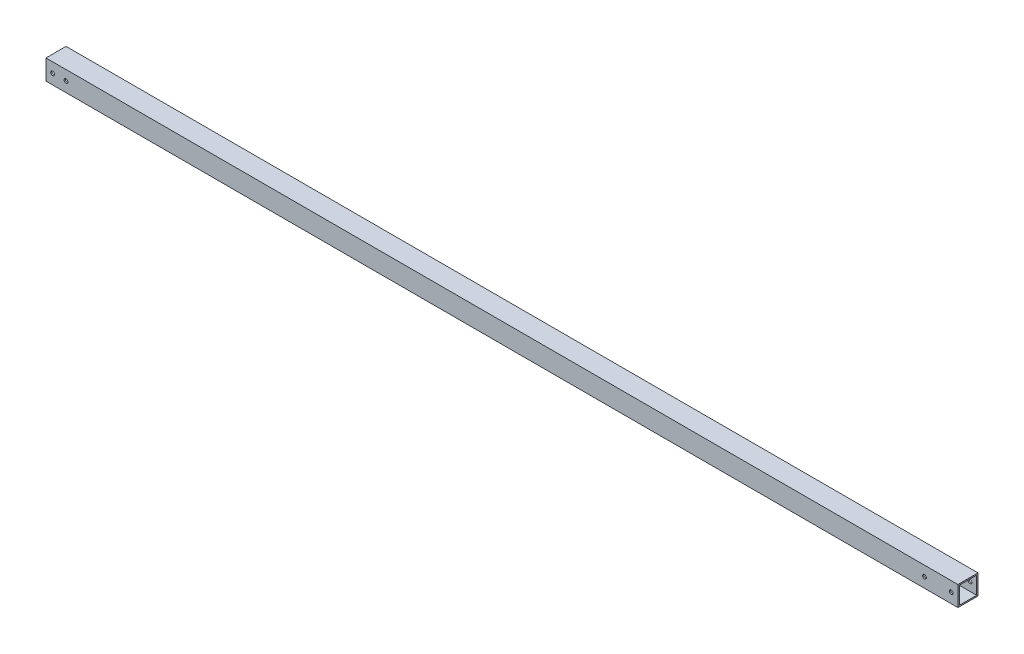
ISO-10303-21;
HEADER;
FILE_DESCRIPTION(('STEP AP214'),'2;1');
FILE_NAME('part.step','',(''),(''),'','','');
FILE_SCHEMA(('AUTOMOTIVE_DESIGN { 1 0 10303 214 1 1 1 1 }'));
ENDSEC;
DATA;
#1=APPLICATION_CONTEXT('core data for automotive mechanical design processes');
#2=APPLICATION_PROTOCOL_DEFINITION('international standard','automotive_design',2000,#1);
#3=PRODUCT_CONTEXT('',#1,'mechanical');
#4=PRODUCT('Part','Part','',(#3));
#5=PRODUCT_RELATED_PRODUCT_CATEGORY('part','',(#4));
#6=PRODUCT_DEFINITION_FORMATION('','',#4);
#7=PRODUCT_DEFINITION_CONTEXT('part definition',#1,'design');
#8=PRODUCT_DEFINITION('design','',#6,#7);
#9=PRODUCT_DEFINITION_SHAPE('','',#8);
#10=(LENGTH_UNIT() NAMED_UNIT(*) SI_UNIT(.MILLI.,.METRE.));
#11=(NAMED_UNIT(*) PLANE_ANGLE_UNIT() SI_UNIT($,.RADIAN.));
#12=(NAMED_UNIT(*) SI_UNIT($,.STERADIAN.) SOLID_ANGLE_UNIT());
#13=UNCERTAINTY_MEASURE_WITH_UNIT(LENGTH_MEASURE(1.E-05),#10,'distance_accuracy_value','');
#14=(GEOMETRIC_REPRESENTATION_CONTEXT(3) GLOBAL_UNCERTAINTY_ASSIGNED_CONTEXT((#13)) GLOBAL_UNIT_ASSIGNED_CONTEXT((#10,
#11,#12)) REPRESENTATION_CONTEXT('',''));
#15=CARTESIAN_POINT('',(0.,0.,0.));
#16=DIRECTION('',(0.,0.,1.));
#17=DIRECTION('',(1.,0.,0.));
#18=AXIS2_PLACEMENT_3D('',#15,#16,#17);
#19=CARTESIAN_POINT('',(681.8,0.,0.));
#20=DIRECTION('',(-1.,0.,0.));
#21=DIRECTION('',(0.,0.,1.));
#22=AXIS2_PLACEMENT_3D('',#19,#20,#21);
#23=PLANE('',#22);
#24=DIRECTION('',(0.,1.,0.));
#25=VECTOR('',#24,1.);
#26=CARTESIAN_POINT('',(681.8,-7.5,-7.5));
#27=LINE('',#26,#25);
#28=CARTESIAN_POINT('',(681.8,-7.5,-7.5));
#29=VERTEX_POINT('',#28);
#30=CARTESIAN_POINT('',(681.8,7.5,-7.5));
#31=VERTEX_POINT('',#30);
#32=EDGE_CURVE('E146',#29,#31,#27,.T.);
#33=ORIENTED_EDGE('',*,*,#32,.T.);
#34=DIRECTION('',(0.,0.,1.));
#35=VECTOR('',#34,1.);
#36=CARTESIAN_POINT('',(681.8,7.5,7.5));
#37=LINE('',#36,#35);
#38=CARTESIAN_POINT('',(681.8,7.5,7.5));
#39=VERTEX_POINT('',#38);
#40=EDGE_CURVE('E149',#31,#39,#37,.T.);
#41=ORIENTED_EDGE('',*,*,#40,.T.);
#42=DIRECTION('',(0.,-1.,0.));
#43=VECTOR('',#42,1.);
#44=CARTESIAN_POINT('',(681.8,-7.5,7.5));
#45=LINE('',#44,#43);
#46=CARTESIAN_POINT('',(681.8,-7.5,7.5));
#47=VERTEX_POINT('',#46);
#48=EDGE_CURVE('E152',#39,#47,#45,.T.);
#49=ORIENTED_EDGE('',*,*,#48,.T.);
#50=DIRECTION('',(0.,0.,-1.));
#51=VECTOR('',#50,1.);
#52=CARTESIAN_POINT('',(681.8,-7.5,7.5));
#53=LINE('',#52,#51);
#54=EDGE_CURVE('E154',#47,#29,#53,.T.);
#55=ORIENTED_EDGE('',*,*,#54,.T.);
#56=EDGE_LOOP('',(#33,#41,#49,#55));
#57=FACE_BOUND('',#56,.T.);
#58=DIRECTION('',(0.,0.,-1.));
#59=VECTOR('',#58,1.);
#60=CARTESIAN_POINT('',(681.8,-6.5,6.5));
#61=LINE('',#60,#59);
#62=CARTESIAN_POINT('',(681.8,-6.5,6.5));
#63=VERTEX_POINT('',#62);
#64=CARTESIAN_POINT('',(681.8,-6.5,-6.5));
#65=VERTEX_POINT('',#64);
#66=EDGE_CURVE('E108',#63,#65,#61,.T.);
#67=ORIENTED_EDGE('',*,*,#66,.F.);
#68=DIRECTION('',(0.,-1.,0.));
#69=VECTOR('',#68,1.);
#70=CARTESIAN_POINT('',(681.8,-6.5,6.5));
#71=LINE('',#70,#69);
#72=CARTESIAN_POINT('',(681.8,6.5,6.5));
#73=VERTEX_POINT('',#72);
#74=EDGE_CURVE('E130',#73,#63,#71,.T.);
#75=ORIENTED_EDGE('',*,*,#74,.F.);
#76=DIRECTION('',(0.,0.,1.));
#77=VECTOR('',#76,1.);
#78=CARTESIAN_POINT('',(681.8,6.5,6.5));
#79=LINE('',#78,#77);
#80=CARTESIAN_POINT('',(681.8,6.5,-6.5));
#81=VERTEX_POINT('',#80);
#82=EDGE_CURVE('E128',#81,#73,#79,.T.);
#83=ORIENTED_EDGE('',*,*,#82,.F.);
#84=DIRECTION('',(0.,1.,0.));
#85=VECTOR('',#84,1.);
#86=CARTESIAN_POINT('',(681.8,-6.5,-6.5));
#87=LINE('',#86,#85);
#88=EDGE_CURVE('E116',#65,#81,#87,.T.);
#89=ORIENTED_EDGE('',*,*,#88,.F.);
#90=EDGE_LOOP('',(#67,#75,#83,#89));
#91=FACE_BOUND('',#90,.T.);
#92=ADVANCED_FACE('F41',(#57,#91),#23,.F.);
#93=CARTESIAN_POINT('',(0.,0.,0.));
#94=DIRECTION('',(-1.,0.,0.));
#95=DIRECTION('',(0.,0.,1.));
#96=AXIS2_PLACEMENT_3D('',#93,#94,#95);
#97=PLANE('',#96);
#98=DIRECTION('',(0.,1.,0.));
#99=VECTOR('',#98,1.);
#100=CARTESIAN_POINT('',(0.,-7.5,-7.5));
#101=LINE('',#100,#99);
#102=CARTESIAN_POINT('',(0.,-7.5,-7.5));
#103=VERTEX_POINT('',#102);
#104=CARTESIAN_POINT('',(0.,7.5,-7.5));
#105=VERTEX_POINT('',#104);
#106=EDGE_CURVE('E124',#103,#105,#101,.T.);
#107=ORIENTED_EDGE('',*,*,#106,.F.);
#108=DIRECTION('',(0.,0.,-1.));
#109=VECTOR('',#108,1.);
#110=CARTESIAN_POINT('',(0.,-7.5,7.5));
#111=LINE('',#110,#109);
#112=CARTESIAN_POINT('',(0.,-7.5,7.5));
#113=VERTEX_POINT('',#112);
#114=EDGE_CURVE('E150',#113,#103,#111,.T.);
#115=ORIENTED_EDGE('',*,*,#114,.F.);
#116=DIRECTION('',(0.,-1.,0.));
#117=VECTOR('',#116,1.);
#118=CARTESIAN_POINT('',(0.,-7.5,7.5));
#119=LINE('',#118,#117);
#120=CARTESIAN_POINT('',(0.,7.5,7.5));
#121=VERTEX_POINT('',#120);
#122=EDGE_CURVE('E161',#121,#113,#119,.T.);
#123=ORIENTED_EDGE('',*,*,#122,.F.);
#124=DIRECTION('',(0.,0.,1.));
#125=VECTOR('',#124,1.);
#126=CARTESIAN_POINT('',(0.,7.5,7.5));
#127=LINE('',#126,#125);
#128=EDGE_CURVE('E159',#105,#121,#127,.T.);
#129=ORIENTED_EDGE('',*,*,#128,.F.);
#130=EDGE_LOOP('',(#107,#115,#123,#129));
#131=FACE_BOUND('',#130,.T.);
#132=DIRECTION('',(0.,-1.,0.));
#133=VECTOR('',#132,1.);
#134=CARTESIAN_POINT('',(0.,-6.5,6.5));
#135=LINE('',#134,#133);
#136=CARTESIAN_POINT('',(0.,6.5,6.5));
#137=VERTEX_POINT('',#136);
#138=CARTESIAN_POINT('',(0.,-6.5,6.5));
#139=VERTEX_POINT('',#138);
#140=EDGE_CURVE('E117',#137,#139,#135,.T.);
#141=ORIENTED_EDGE('',*,*,#140,.T.);
#142=DIRECTION('',(0.,0.,-1.));
#143=VECTOR('',#142,1.);
#144=CARTESIAN_POINT('',(0.,-6.5,6.5));
#145=LINE('',#144,#143);
#146=CARTESIAN_POINT('',(0.,-6.5,-6.5));
#147=VERTEX_POINT('',#146);
#148=EDGE_CURVE('E66',#139,#147,#145,.T.);
#149=ORIENTED_EDGE('',*,*,#148,.T.);
#150=DIRECTION('',(0.,1.,0.));
#151=VECTOR('',#150,1.);
#152=CARTESIAN_POINT('',(0.,-6.5,-6.5));
#153=LINE('',#152,#151);
#154=CARTESIAN_POINT('',(0.,6.5,-6.5));
#155=VERTEX_POINT('',#154);
#156=EDGE_CURVE('E123',#147,#155,#153,.T.);
#157=ORIENTED_EDGE('',*,*,#156,.T.);
#158=DIRECTION('',(0.,0.,1.));
#159=VECTOR('',#158,1.);
#160=CARTESIAN_POINT('',(0.,6.5,6.5));
#161=LINE('',#160,#159);
#162=EDGE_CURVE('E138',#155,#137,#161,.T.);
#163=ORIENTED_EDGE('',*,*,#162,.T.);
#164=EDGE_LOOP('',(#141,#149,#157,#163));
#165=FACE_BOUND('',#164,.T.);
#166=ADVANCED_FACE('F213',(#131,#165),#97,.T.);
#167=CARTESIAN_POINT('',(681.8,-7.5,-7.5));
#168=DIRECTION('',(0.,0.,1.));
#169=DIRECTION('',(1.,0.,0.));
#170=AXIS2_PLACEMENT_3D('',#167,#168,#169);
#171=PLANE('',#170);
#172=CARTESIAN_POINT('',(5.000000000015,-1.49116829994966E-10,-7.5));
#173=DIRECTION('',(0.,0.,-1.));
#174=DIRECTION('',(-1.,0.,0.));
#175=AXIS2_PLACEMENT_3D('',#172,#173,#174);
#176=CIRCLE('',#175,1.45000000000004);
#177=CARTESIAN_POINT('',(3.55000000001497,-1.49116829994966E-10,-7.5));
#178=VERTEX_POINT('',#177);
#179=EDGE_CURVE('E264',#178,#178,#176,.T.);
#180=ORIENTED_EDGE('',*,*,#179,.F.);
#181=EDGE_LOOP('',(#180));
#182=FACE_BOUND('',#181,.T.);
#183=CARTESIAN_POINT('',(15.000000000015,-1.46872097817052E-10,-7.5));
#184=DIRECTION('',(0.,0.,-1.));
#185=DIRECTION('',(-1.,0.,0.));
#186=AXIS2_PLACEMENT_3D('',#183,#184,#185);
#187=CIRCLE('',#186,1.45000000000003);
#188=CARTESIAN_POINT('',(13.550000000015,-1.46872097817052E-10,-7.5));
#189=VERTEX_POINT('',#188);
#190=EDGE_CURVE('E268',#189,#189,#187,.T.);
#191=ORIENTED_EDGE('',*,*,#190,.F.);
#192=EDGE_LOOP('',(#191));
#193=FACE_BOUND('',#192,.T.);
#194=CARTESIAN_POINT('',(656.800000001746,2.31759056390501E-12,-7.5));
#195=DIRECTION('',(0.,0.,-1.));
#196=DIRECTION('',(-1.,0.,0.));
#197=AXIS2_PLACEMENT_3D('',#194,#195,#196);
#198=CIRCLE('',#197,1.44999999999982);
#199=CARTESIAN_POINT('',(655.350000001746,2.31759056390501E-12,-7.5));
#200=VERTEX_POINT('',#199);
#201=EDGE_CURVE('E272',#200,#200,#198,.T.);
#202=ORIENTED_EDGE('',*,*,#201,.F.);
#203=EDGE_LOOP('',(#202));
#204=FACE_BOUND('',#203,.T.);
#205=CARTESIAN_POINT('',(676.800000001746,2.33840724561674E-12,-7.5));
#206=DIRECTION('',(0.,0.,-1.));
#207=DIRECTION('',(-1.,0.,0.));
#208=AXIS2_PLACEMENT_3D('',#205,#206,#207);
#209=CIRCLE('',#208,1.44999999999971);
#210=CARTESIAN_POINT('',(675.350000001746,2.33840724561674E-12,-7.5));
#211=VERTEX_POINT('',#210);
#212=EDGE_CURVE('E275',#211,#211,#209,.T.);
#213=ORIENTED_EDGE('',*,*,#212,.F.);
#214=EDGE_LOOP('',(#213));
#215=FACE_BOUND('',#214,.T.);
#216=ORIENTED_EDGE('',*,*,#106,.T.);
#217=DIRECTION('',(-1.,0.,0.));
#218=VECTOR('',#217,1.);
#219=CARTESIAN_POINT('',(681.8,7.5,-7.5));
#220=LINE('',#219,#218);
#221=EDGE_CURVE('E11',#31,#105,#220,.T.);
#222=ORIENTED_EDGE('',*,*,#221,.F.);
#223=ORIENTED_EDGE('',*,*,#32,.F.);
#224=DIRECTION('',(-1.,0.,0.));
#225=VECTOR('',#224,1.);
#226=CARTESIAN_POINT('',(681.8,-7.5,-7.5));
#227=LINE('',#226,#225);
#228=EDGE_CURVE('E156',#29,#103,#227,.T.);
#229=ORIENTED_EDGE('',*,*,#228,.T.);
#230=EDGE_LOOP('',(#216,#222,#223,#229));
#231=FACE_BOUND('',#230,.T.);
#232=ADVANCED_FACE('F43',(#182,#193,#204,#215,#231),#171,.F.);
#233=CARTESIAN_POINT('',(681.8,7.5,7.5));
#234=DIRECTION('',(0.,-1.,0.));
#235=DIRECTION('',(0.,0.,-1.));
#236=AXIS2_PLACEMENT_3D('',#233,#234,#235);
#237=PLANE('',#236);
#238=ORIENTED_EDGE('',*,*,#128,.T.);
#239=DIRECTION('',(-1.,0.,0.));
#240=VECTOR('',#239,1.);
#241=CARTESIAN_POINT('',(681.8,7.5,7.5));
#242=LINE('',#241,#240);
#243=EDGE_CURVE('E50',#39,#121,#242,.T.);
#244=ORIENTED_EDGE('',*,*,#243,.F.);
#245=ORIENTED_EDGE('',*,*,#40,.F.);
#246=ORIENTED_EDGE('',*,*,#221,.T.);
#247=EDGE_LOOP('',(#238,#244,#245,#246));
#248=FACE_BOUND('',#247,.T.);
#249=ADVANCED_FACE('F240',(#248),#237,.F.);
#250=CARTESIAN_POINT('',(681.8,-7.5,7.5));
#251=DIRECTION('',(0.,0.,-1.));
#252=DIRECTION('',(-1.,0.,0.));
#253=AXIS2_PLACEMENT_3D('',#250,#251,#252);
#254=PLANE('',#253);
#255=CARTESIAN_POINT('',(5.000000000015,-1.49116829994966E-10,7.5));
#256=DIRECTION('',(0.,0.,-1.));
#257=DIRECTION('',(-1.,0.,0.));
#258=AXIS2_PLACEMENT_3D('',#255,#256,#257);
#259=CIRCLE('',#258,1.45000000000004);
#260=CARTESIAN_POINT('',(3.55000000001497,-1.49116829994966E-10,7.5));
#261=VERTEX_POINT('',#260);
#262=EDGE_CURVE('E175',#261,#261,#259,.T.);
#263=ORIENTED_EDGE('',*,*,#262,.T.);
#264=EDGE_LOOP('',(#263));
#265=FACE_BOUND('',#264,.T.);
#266=CARTESIAN_POINT('',(15.000000000015,-1.46872097817052E-10,7.5));
#267=DIRECTION('',(0.,0.,-1.));
#268=DIRECTION('',(-1.,0.,0.));
#269=AXIS2_PLACEMENT_3D('',#266,#267,#268);
#270=CIRCLE('',#269,1.45000000000003);
#271=CARTESIAN_POINT('',(13.550000000015,-1.46872097817052E-10,7.5));
#272=VERTEX_POINT('',#271);
#273=EDGE_CURVE('E285',#272,#272,#270,.T.);
#274=ORIENTED_EDGE('',*,*,#273,.T.);
#275=EDGE_LOOP('',(#274));
#276=FACE_BOUND('',#275,.T.);
#277=CARTESIAN_POINT('',(656.800000001746,2.31759056390501E-12,7.5));
#278=DIRECTION('',(0.,0.,-1.));
#279=DIRECTION('',(-1.,0.,0.));
#280=AXIS2_PLACEMENT_3D('',#277,#278,#279);
#281=CIRCLE('',#280,1.44999999999982);
#282=CARTESIAN_POINT('',(655.350000001746,2.31759056390501E-12,7.5));
#283=VERTEX_POINT('',#282);
#284=EDGE_CURVE('E277',#283,#283,#281,.T.);
#285=ORIENTED_EDGE('',*,*,#284,.T.);
#286=EDGE_LOOP('',(#285));
#287=FACE_BOUND('',#286,.T.);
#288=CARTESIAN_POINT('',(676.800000001746,2.33840724561674E-12,7.5));
#289=DIRECTION('',(0.,0.,-1.));
#290=DIRECTION('',(-1.,0.,0.));
#291=AXIS2_PLACEMENT_3D('',#288,#289,#290);
#292=CIRCLE('',#291,1.44999999999971);
#293=CARTESIAN_POINT('',(675.350000001746,2.33840724561674E-12,7.5));
#294=VERTEX_POINT('',#293);
#295=EDGE_CURVE('E278',#294,#294,#292,.T.);
#296=ORIENTED_EDGE('',*,*,#295,.T.);
#297=EDGE_LOOP('',(#296));
#298=FACE_BOUND('',#297,.T.);
#299=ORIENTED_EDGE('',*,*,#122,.T.);
#300=DIRECTION('',(-1.,0.,0.));
#301=VECTOR('',#300,1.);
#302=CARTESIAN_POINT('',(681.8,-7.5,7.5));
#303=LINE('',#302,#301);
#304=EDGE_CURVE('E166',#47,#113,#303,.T.);
#305=ORIENTED_EDGE('',*,*,#304,.F.);
#306=ORIENTED_EDGE('',*,*,#48,.F.);
#307=ORIENTED_EDGE('',*,*,#243,.T.);
#308=EDGE_LOOP('',(#299,#305,#306,#307));
#309=FACE_BOUND('',#308,.T.);
#310=ADVANCED_FACE('F237',(#265,#276,#287,#298,#309),#254,.F.);
#311=CARTESIAN_POINT('',(681.8,-7.5,7.5));
#312=DIRECTION('',(0.,1.,0.));
#313=DIRECTION('',(0.,0.,1.));
#314=AXIS2_PLACEMENT_3D('',#311,#312,#313);
#315=PLANE('',#314);
#316=ORIENTED_EDGE('',*,*,#114,.T.);
#317=ORIENTED_EDGE('',*,*,#228,.F.);
#318=ORIENTED_EDGE('',*,*,#54,.F.);
#319=ORIENTED_EDGE('',*,*,#304,.T.);
#320=EDGE_LOOP('',(#316,#317,#318,#319));
#321=FACE_BOUND('',#320,.T.);
#322=ADVANCED_FACE('F234',(#321),#315,.F.);
#323=CARTESIAN_POINT('',(681.8,-6.5,6.5));
#324=DIRECTION('',(0.,1.,0.));
#325=DIRECTION('',(0.,0.,1.));
#326=AXIS2_PLACEMENT_3D('',#323,#324,#325);
#327=PLANE('',#326);
#328=ORIENTED_EDGE('',*,*,#148,.F.);
#329=DIRECTION('',(-1.,0.,0.));
#330=VECTOR('',#329,1.);
#331=CARTESIAN_POINT('',(681.8,-6.5,6.5));
#332=LINE('',#331,#330);
#333=EDGE_CURVE('E112',#63,#139,#332,.T.);
#334=ORIENTED_EDGE('',*,*,#333,.F.);
#335=ORIENTED_EDGE('',*,*,#66,.T.);
#336=DIRECTION('',(-1.,0.,0.));
#337=VECTOR('',#336,1.);
#338=CARTESIAN_POINT('',(681.8,-6.5,-6.5));
#339=LINE('',#338,#337);
#340=EDGE_CURVE('E111',#65,#147,#339,.T.);
#341=ORIENTED_EDGE('',*,*,#340,.T.);
#342=EDGE_LOOP('',(#328,#334,#335,#341));
#343=FACE_BOUND('',#342,.T.);
#344=ADVANCED_FACE('F110',(#343),#327,.T.);
#345=CARTESIAN_POINT('',(681.8,-6.5,-6.5));
#346=DIRECTION('',(0.,0.,1.));
#347=DIRECTION('',(0.,-1.,0.));
#348=AXIS2_PLACEMENT_3D('',#345,#346,#347);
#349=PLANE('',#348);
#350=CARTESIAN_POINT('',(5.000000000015,-1.49116829994966E-10,-6.5));
#351=DIRECTION('',(0.,0.,1.));
#352=DIRECTION('',(0.,-1.,0.));
#353=AXIS2_PLACEMENT_3D('',#350,#351,#352);
#354=CIRCLE('',#353,1.45000000000004);
#355=CARTESIAN_POINT('',(5.000000000015,-1.45000000014915,-6.5));
#356=VERTEX_POINT('',#355);
#357=EDGE_CURVE('E136',#356,#356,#354,.T.);
#358=ORIENTED_EDGE('',*,*,#357,.F.);
#359=EDGE_LOOP('',(#358));
#360=FACE_BOUND('',#359,.T.);
#361=CARTESIAN_POINT('',(15.000000000015,-1.46872097817052E-10,-6.5));
#362=DIRECTION('',(0.,0.,1.));
#363=DIRECTION('',(0.,-1.,0.));
#364=AXIS2_PLACEMENT_3D('',#361,#362,#363);
#365=CIRCLE('',#364,1.45000000000003);
#366=CARTESIAN_POINT('',(15.000000000015,-1.4500000001469,-6.5));
#367=VERTEX_POINT('',#366);
#368=EDGE_CURVE('E181',#367,#367,#365,.T.);
#369=ORIENTED_EDGE('',*,*,#368,.F.);
#370=EDGE_LOOP('',(#369));
#371=FACE_BOUND('',#370,.T.);
#372=CARTESIAN_POINT('',(656.800000001746,2.31759056390501E-12,-6.5));
#373=DIRECTION('',(0.,0.,1.));
#374=DIRECTION('',(0.,-1.,0.));
#375=AXIS2_PLACEMENT_3D('',#372,#373,#374);
#376=CIRCLE('',#375,1.44999999999982);
#377=CARTESIAN_POINT('',(656.800000001746,-1.4499999999975,-6.5));
#378=VERTEX_POINT('',#377);
#379=EDGE_CURVE('E178',#378,#378,#376,.T.);
#380=ORIENTED_EDGE('',*,*,#379,.F.);
#381=EDGE_LOOP('',(#380));
#382=FACE_BOUND('',#381,.T.);
#383=CARTESIAN_POINT('',(676.800000001746,2.33840724561674E-12,-6.5));
#384=DIRECTION('',(0.,0.,1.));
#385=DIRECTION('',(0.,-1.,0.));
#386=AXIS2_PLACEMENT_3D('',#383,#384,#385);
#387=CIRCLE('',#386,1.44999999999971);
#388=CARTESIAN_POINT('',(676.800000001746,-1.44999999999737,-6.5));
#389=VERTEX_POINT('',#388);
#390=EDGE_CURVE('E174',#389,#389,#387,.T.);
#391=ORIENTED_EDGE('',*,*,#390,.F.);
#392=EDGE_LOOP('',(#391));
#393=FACE_BOUND('',#392,.T.);
#394=ORIENTED_EDGE('',*,*,#156,.F.);
#395=ORIENTED_EDGE('',*,*,#340,.F.);
#396=ORIENTED_EDGE('',*,*,#88,.T.);
#397=DIRECTION('',(-1.,0.,0.));
#398=VECTOR('',#397,1.);
#399=CARTESIAN_POINT('',(681.8,6.5,-6.5));
#400=LINE('',#399,#398);
#401=EDGE_CURVE('E125',#81,#155,#400,.T.);
#402=ORIENTED_EDGE('',*,*,#401,.T.);
#403=EDGE_LOOP('',(#394,#395,#396,#402));
#404=FACE_BOUND('',#403,.T.);
#405=ADVANCED_FACE('F120',(#360,#371,#382,#393,#404),#349,.T.);
#406=CARTESIAN_POINT('',(681.8,6.5,6.5));
#407=DIRECTION('',(0.,-1.,0.));
#408=DIRECTION('',(0.,0.,-1.));
#409=AXIS2_PLACEMENT_3D('',#406,#407,#408);
#410=PLANE('',#409);
#411=ORIENTED_EDGE('',*,*,#162,.F.);
#412=ORIENTED_EDGE('',*,*,#401,.F.);
#413=ORIENTED_EDGE('',*,*,#82,.T.);
#414=DIRECTION('',(-1.,0.,0.));
#415=VECTOR('',#414,1.);
#416=CARTESIAN_POINT('',(681.8,6.5,6.5));
#417=LINE('',#416,#415);
#418=EDGE_CURVE('E58',#73,#137,#417,.T.);
#419=ORIENTED_EDGE('',*,*,#418,.T.);
#420=EDGE_LOOP('',(#411,#412,#413,#419));
#421=FACE_BOUND('',#420,.T.);
#422=ADVANCED_FACE('F205',(#421),#410,.T.);
#423=CARTESIAN_POINT('',(681.8,-6.5,6.5));
#424=DIRECTION('',(0.,0.,-1.));
#425=DIRECTION('',(-1.,0.,0.));
#426=AXIS2_PLACEMENT_3D('',#423,#424,#425);
#427=PLANE('',#426);
#428=CARTESIAN_POINT('',(5.000000000015,-1.49116829994966E-10,6.5));
#429=DIRECTION('',(0.,0.,-1.));
#430=DIRECTION('',(-1.,0.,0.));
#431=AXIS2_PLACEMENT_3D('',#428,#429,#430);
#432=CIRCLE('',#431,1.45000000000004);
#433=CARTESIAN_POINT('',(3.55000000001497,-1.49116829994966E-10,6.5));
#434=VERTEX_POINT('',#433);
#435=EDGE_CURVE('E45',#434,#434,#432,.T.);
#436=ORIENTED_EDGE('',*,*,#435,.F.);
#437=EDGE_LOOP('',(#436));
#438=FACE_BOUND('',#437,.T.);
#439=CARTESIAN_POINT('',(15.000000000015,-1.46872097817052E-10,6.5));
#440=DIRECTION('',(0.,0.,-1.));
#441=DIRECTION('',(-1.,0.,0.));
#442=AXIS2_PLACEMENT_3D('',#439,#440,#441);
#443=CIRCLE('',#442,1.45000000000003);
#444=CARTESIAN_POINT('',(13.550000000015,-1.46872097817052E-10,6.5));
#445=VERTEX_POINT('',#444);
#446=EDGE_CURVE('E179',#445,#445,#443,.T.);
#447=ORIENTED_EDGE('',*,*,#446,.F.);
#448=EDGE_LOOP('',(#447));
#449=FACE_BOUND('',#448,.T.);
#450=CARTESIAN_POINT('',(656.800000001746,2.31759056390501E-12,6.5));
#451=DIRECTION('',(0.,0.,-1.));
#452=DIRECTION('',(-1.,0.,0.));
#453=AXIS2_PLACEMENT_3D('',#450,#451,#452);
#454=CIRCLE('',#453,1.44999999999982);
#455=CARTESIAN_POINT('',(655.350000001746,2.31759056390501E-12,6.5));
#456=VERTEX_POINT('',#455);
#457=EDGE_CURVE('E176',#456,#456,#454,.T.);
#458=ORIENTED_EDGE('',*,*,#457,.F.);
#459=EDGE_LOOP('',(#458));
#460=FACE_BOUND('',#459,.T.);
#461=CARTESIAN_POINT('',(676.800000001746,2.33840724561674E-12,6.5));
#462=DIRECTION('',(0.,0.,-1.));
#463=DIRECTION('',(-1.,0.,0.));
#464=AXIS2_PLACEMENT_3D('',#461,#462,#463);
#465=CIRCLE('',#464,1.44999999999971);
#466=CARTESIAN_POINT('',(675.350000001746,2.33840724561674E-12,6.5));
#467=VERTEX_POINT('',#466);
#468=EDGE_CURVE('E171',#467,#467,#465,.T.);
#469=ORIENTED_EDGE('',*,*,#468,.F.);
#470=EDGE_LOOP('',(#469));
#471=FACE_BOUND('',#470,.T.);
#472=ORIENTED_EDGE('',*,*,#140,.F.);
#473=ORIENTED_EDGE('',*,*,#418,.F.);
#474=ORIENTED_EDGE('',*,*,#74,.T.);
#475=ORIENTED_EDGE('',*,*,#333,.T.);
#476=EDGE_LOOP('',(#472,#473,#474,#475));
#477=FACE_BOUND('',#476,.T.);
#478=ADVANCED_FACE('F201',(#438,#449,#460,#471,#477),#427,.T.);
#479=CARTESIAN_POINT('',(676.800000001746,2.33840724561674E-12,7.5));
#480=DIRECTION('',(0.,0.,-1.));
#481=DIRECTION('',(-1.,0.,0.));
#482=AXIS2_PLACEMENT_3D('',#479,#480,#481);
#483=CYLINDRICAL_SURFACE('',#482,1.44999999999971);
#484=ORIENTED_EDGE('',*,*,#468,.T.);
#485=EDGE_LOOP('',(#484));
#486=FACE_BOUND('',#485,.T.);
#487=ORIENTED_EDGE('',*,*,#295,.F.);
#488=EDGE_LOOP('',(#487));
#489=FACE_BOUND('',#488,.T.);
#490=ADVANCED_FACE('F204',(#486,#489),#483,.F.);
#491=CARTESIAN_POINT('',(656.800000001746,2.31759056390501E-12,7.5));
#492=DIRECTION('',(0.,0.,-1.));
#493=DIRECTION('',(-1.,0.,0.));
#494=AXIS2_PLACEMENT_3D('',#491,#492,#493);
#495=CYLINDRICAL_SURFACE('',#494,1.44999999999982);
#496=ORIENTED_EDGE('',*,*,#457,.T.);
#497=EDGE_LOOP('',(#496));
#498=FACE_BOUND('',#497,.T.);
#499=ORIENTED_EDGE('',*,*,#284,.F.);
#500=EDGE_LOOP('',(#499));
#501=FACE_BOUND('',#500,.T.);
#502=ADVANCED_FACE('F305',(#498,#501),#495,.F.);
#503=CARTESIAN_POINT('',(15.000000000015,-1.46872097817052E-10,7.5));
#504=DIRECTION('',(0.,0.,-1.));
#505=DIRECTION('',(-1.,0.,0.));
#506=AXIS2_PLACEMENT_3D('',#503,#504,#505);
#507=CYLINDRICAL_SURFACE('',#506,1.45000000000003);
#508=ORIENTED_EDGE('',*,*,#446,.T.);
#509=EDGE_LOOP('',(#508));
#510=FACE_BOUND('',#509,.T.);
#511=ORIENTED_EDGE('',*,*,#273,.F.);
#512=EDGE_LOOP('',(#511));
#513=FACE_BOUND('',#512,.T.);
#514=ADVANCED_FACE('F295',(#510,#513),#507,.F.);
#515=CARTESIAN_POINT('',(5.000000000015,-1.49116829994966E-10,7.5));
#516=DIRECTION('',(0.,0.,-1.));
#517=DIRECTION('',(-1.,0.,0.));
#518=AXIS2_PLACEMENT_3D('',#515,#516,#517);
#519=CYLINDRICAL_SURFACE('',#518,1.45000000000004);
#520=ORIENTED_EDGE('',*,*,#435,.T.);
#521=EDGE_LOOP('',(#520));
#522=FACE_BOUND('',#521,.T.);
#523=ORIENTED_EDGE('',*,*,#262,.F.);
#524=EDGE_LOOP('',(#523));
#525=FACE_BOUND('',#524,.T.);
#526=ADVANCED_FACE('F198',(#522,#525),#519,.F.);
#527=ORIENTED_EDGE('',*,*,#390,.T.);
#528=EDGE_LOOP('',(#527));
#529=FACE_BOUND('',#528,.T.);
#530=ORIENTED_EDGE('',*,*,#212,.T.);
#531=EDGE_LOOP('',(#530));
#532=FACE_BOUND('',#531,.T.);
#533=ADVANCED_FACE('F294',(#529,#532),#483,.F.);
#534=ORIENTED_EDGE('',*,*,#379,.T.);
#535=EDGE_LOOP('',(#534));
#536=FACE_BOUND('',#535,.T.);
#537=ORIENTED_EDGE('',*,*,#201,.T.);
#538=EDGE_LOOP('',(#537));
#539=FACE_BOUND('',#538,.T.);
#540=ADVANCED_FACE('F302',(#536,#539),#495,.F.);
#541=ORIENTED_EDGE('',*,*,#368,.T.);
#542=EDGE_LOOP('',(#541));
#543=FACE_BOUND('',#542,.T.);
#544=ORIENTED_EDGE('',*,*,#190,.T.);
#545=EDGE_LOOP('',(#544));
#546=FACE_BOUND('',#545,.T.);
#547=ADVANCED_FACE('F307',(#543,#546),#507,.F.);
#548=ORIENTED_EDGE('',*,*,#357,.T.);
#549=EDGE_LOOP('',(#548));
#550=FACE_BOUND('',#549,.T.);
#551=ORIENTED_EDGE('',*,*,#179,.T.);
#552=EDGE_LOOP('',(#551));
#553=FACE_BOUND('',#552,.T.);
#554=ADVANCED_FACE('F297',(#550,#553),#519,.F.);
#555=CLOSED_SHELL('',(#92,#166,#232,#249,#310,#322,#344,#405,#422,#478,#490,#502,#514,#526,#533,
#540,#547,#554));
#556=MANIFOLD_SOLID_BREP('B2',#555);
#557=ADVANCED_BREP_SHAPE_REPRESENTATION('',(#18,#556),#14);
#558=SHAPE_DEFINITION_REPRESENTATION(#9,#557);
ENDSEC;
END-ISO-10303-21;
